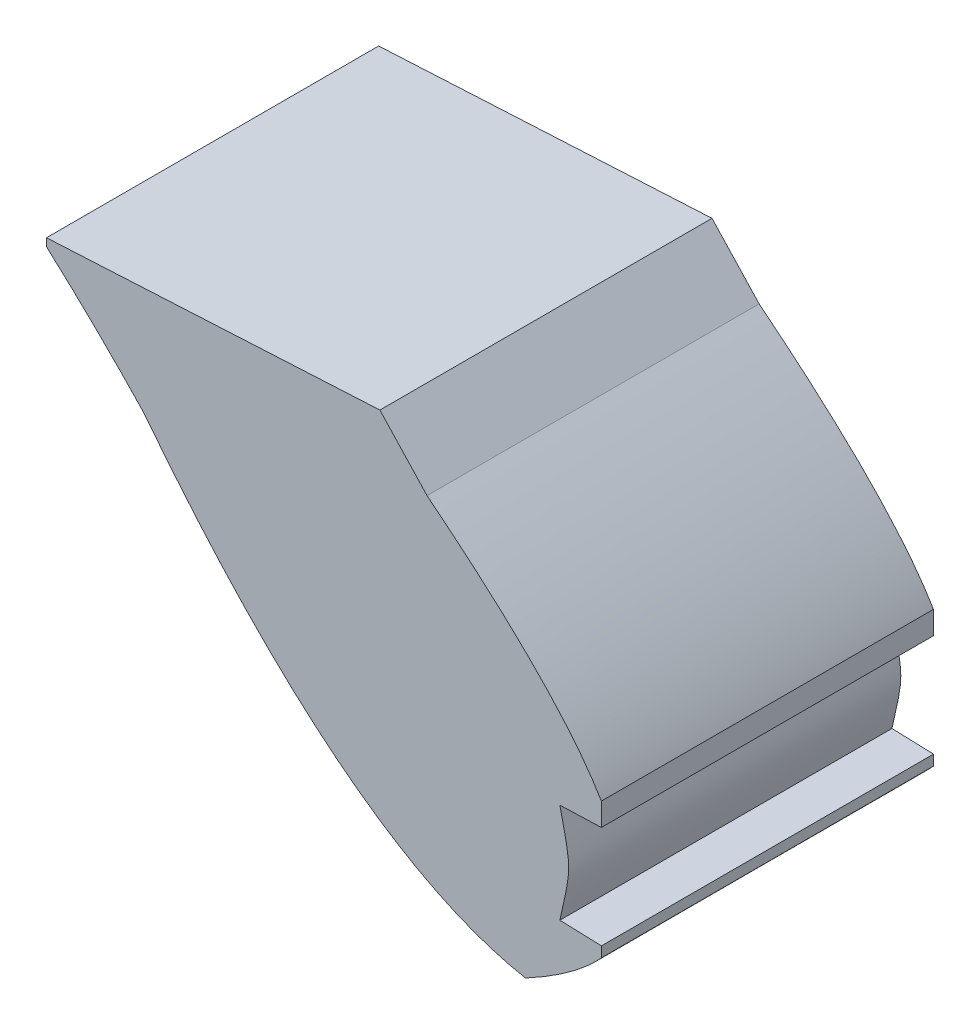
ISO-10303-21;
HEADER;
FILE_DESCRIPTION(('STEP AP214'),'2;1');
FILE_NAME('part.step','',(''),(''),'','','');
FILE_SCHEMA(('AUTOMOTIVE_DESIGN { 1 0 10303 214 1 1 1 1 }'));
ENDSEC;
DATA;
#1=APPLICATION_CONTEXT('core data for automotive mechanical design processes');
#2=APPLICATION_PROTOCOL_DEFINITION('international standard','automotive_design',2000,#1);
#3=PRODUCT_CONTEXT('',#1,'mechanical');
#4=PRODUCT('Part','Part','',(#3));
#5=PRODUCT_RELATED_PRODUCT_CATEGORY('part','',(#4));
#6=PRODUCT_DEFINITION_FORMATION('','',#4);
#7=PRODUCT_DEFINITION_CONTEXT('part definition',#1,'design');
#8=PRODUCT_DEFINITION('design','',#6,#7);
#9=PRODUCT_DEFINITION_SHAPE('','',#8);
#10=(LENGTH_UNIT() NAMED_UNIT(*) SI_UNIT(.MILLI.,.METRE.));
#11=(NAMED_UNIT(*) PLANE_ANGLE_UNIT() SI_UNIT($,.RADIAN.));
#12=(NAMED_UNIT(*) SI_UNIT($,.STERADIAN.) SOLID_ANGLE_UNIT());
#13=UNCERTAINTY_MEASURE_WITH_UNIT(LENGTH_MEASURE(1.E-05),#10,'distance_accuracy_value','');
#14=(GEOMETRIC_REPRESENTATION_CONTEXT(3) GLOBAL_UNCERTAINTY_ASSIGNED_CONTEXT((#13)) GLOBAL_UNIT_ASSIGNED_CONTEXT((#10,
#11,#12)) REPRESENTATION_CONTEXT('',''));
#15=CARTESIAN_POINT('',(0.,0.,0.));
#16=DIRECTION('',(0.,0.,1.));
#17=DIRECTION('',(1.,0.,0.));
#18=AXIS2_PLACEMENT_3D('',#15,#16,#17);
#19=CARTESIAN_POINT('',(-18.9451921135982,7.54091889574655,7.));
#20=CARTESIAN_POINT('',(-10.2150083842792,-3.69764410322756,7.));
#21=CARTESIAN_POINT('',(-2.84660482498738,-5.05908110388432,7.));
#22=(BOUNDED_CURVE() B_SPLINE_CURVE(2,(#19,#20,#21),.UNSPECIFIED.,.F.,
.F.) B_SPLINE_CURVE_WITH_KNOTS((3,3),(0.497667241108509,0.499554279588011),
.UNSPECIFIED.) CURVE() GEOMETRIC_REPRESENTATION_ITEM() RATIONAL_B_SPLINE_CURVE((1.,1.,1.)) REPRESENTATION_ITEM(''));
#23=DIRECTION('',(0.,0.,-1.));
#24=VECTOR('',#23,1.);
#25=SURFACE_OF_LINEAR_EXTRUSION('',#22,#24);
#26=CARTESIAN_POINT('',(-18.9451921135982,7.54091889574655,-7.));
#27=CARTESIAN_POINT('',(-10.2150083842792,-3.69764410322756,-7.));
#28=CARTESIAN_POINT('',(-2.84660482498738,-5.05908110388432,-7.));
#29=(BOUNDED_CURVE() B_SPLINE_CURVE(2,(#26,#27,#28),.UNSPECIFIED.,.F.,
.F.) B_SPLINE_CURVE_WITH_KNOTS((3,3),(0.497667241108509,0.499554279588011),
.UNSPECIFIED.) CURVE() GEOMETRIC_REPRESENTATION_ITEM() RATIONAL_B_SPLINE_CURVE((1.,1.,1.)) REPRESENTATION_ITEM(''));
#30=CARTESIAN_POINT('',(-18.9451921135982,7.54091889574657,-7.));
#31=VERTEX_POINT('',#30);
#32=CARTESIAN_POINT('',(-2.84660482498738,-5.05908110388432,-7.));
#33=VERTEX_POINT('',#32);
#34=EDGE_CURVE('E158',#31,#33,#29,.T.);
#35=ORIENTED_EDGE('',*,*,#34,.T.);
#36=DIRECTION('',(0.,0.,-1.));
#37=VECTOR('',#36,1.);
#38=CARTESIAN_POINT('',(-2.84660482498738,-5.05908110388432,7.));
#39=LINE('',#38,#37);
#40=CARTESIAN_POINT('',(-2.84660482498738,-5.05908110388432,7.));
#41=VERTEX_POINT('',#40);
#42=EDGE_CURVE('E11',#41,#33,#39,.T.);
#43=ORIENTED_EDGE('',*,*,#42,.F.);
#44=CARTESIAN_POINT('',(-18.9451921135982,7.54091889574657,7.));
#45=VERTEX_POINT('',#44);
#46=EDGE_CURVE('E206',#45,#41,#22,.T.);
#47=ORIENTED_EDGE('',*,*,#46,.F.);
#48=DIRECTION('',(0.,0.,-1.));
#49=VECTOR('',#48,1.);
#50=CARTESIAN_POINT('',(-18.9451921135982,7.54091889574657,7.));
#51=LINE('',#50,#49);
#52=EDGE_CURVE('E58',#45,#31,#51,.T.);
#53=ORIENTED_EDGE('',*,*,#52,.T.);
#54=EDGE_LOOP('',(#35,#43,#47,#53));
#55=FACE_BOUND('',#54,.T.);
#56=ADVANCED_FACE('F43',(#55),#25,.F.);
#57=CARTESIAN_POINT('',(-2.84660482498738,-5.05908110388432,7.));
#58=CARTESIAN_POINT('',(-0.742366881974002,-3.93520659958673,7.));
#59=CARTESIAN_POINT('',(0.355124999965198,-2.72325322699678,7.));
#60=(BOUNDED_CURVE() B_SPLINE_CURVE(2,(#57,#58,#59),.UNSPECIFIED.,.F.,
.F.) B_SPLINE_CURVE_WITH_KNOTS((3,3),(0.498812074629495,0.499412845463797),
.UNSPECIFIED.) CURVE() GEOMETRIC_REPRESENTATION_ITEM() RATIONAL_B_SPLINE_CURVE((1.,1.,1.)) REPRESENTATION_ITEM(''));
#61=DIRECTION('',(0.,0.,-1.));
#62=VECTOR('',#61,1.);
#63=SURFACE_OF_LINEAR_EXTRUSION('',#60,#62);
#64=CARTESIAN_POINT('',(-2.84660482498738,-5.05908110388432,-7.));
#65=CARTESIAN_POINT('',(-0.742366881974002,-3.93520659958673,-7.));
#66=CARTESIAN_POINT('',(0.355124999965198,-2.72325322699678,-7.));
#67=(BOUNDED_CURVE() B_SPLINE_CURVE(2,(#64,#65,#66),.UNSPECIFIED.,.F.,
.F.) B_SPLINE_CURVE_WITH_KNOTS((3,3),(0.498812074629495,0.499412845463797),
.UNSPECIFIED.) CURVE() GEOMETRIC_REPRESENTATION_ITEM() RATIONAL_B_SPLINE_CURVE((1.,1.,1.)) REPRESENTATION_ITEM(''));
#68=CARTESIAN_POINT('',(0.355124999965198,-2.72325322699678,-7.));
#69=VERTEX_POINT('',#68);
#70=EDGE_CURVE('E165',#33,#69,#67,.T.);
#71=ORIENTED_EDGE('',*,*,#70,.T.);
#72=DIRECTION('',(0.,0.,-1.));
#73=VECTOR('',#72,1.);
#74=CARTESIAN_POINT('',(0.355124999965198,-2.72325322699678,7.));
#75=LINE('',#74,#73);
#76=CARTESIAN_POINT('',(0.355124999965198,-2.72325322699678,7.));
#77=VERTEX_POINT('',#76);
#78=EDGE_CURVE('E55',#77,#69,#75,.T.);
#79=ORIENTED_EDGE('',*,*,#78,.F.);
#80=EDGE_CURVE('E104',#41,#77,#60,.T.);
#81=ORIENTED_EDGE('',*,*,#80,.F.);
#82=ORIENTED_EDGE('',*,*,#42,.T.);
#83=EDGE_LOOP('',(#71,#79,#81,#82));
#84=FACE_BOUND('',#83,.T.);
#85=ADVANCED_FACE('F227',(#84),#63,.F.);
#86=CARTESIAN_POINT('',(0.355125000532009,-7.39148800447813E-11,7.));
#87=DIRECTION('',(1.,-2.08137641489758E-10,0.));
#88=DIRECTION('',(2.08137641489758E-10,1.,0.));
#89=AXIS2_PLACEMENT_3D('',#86,#87,#88);
#90=PLANE('',#89);
#91=DIRECTION('',(-2.08137641489758E-10,-1.,0.));
#92=VECTOR('',#91,1.);
#93=CARTESIAN_POINT('',(0.355125000532009,-7.39148800447813E-11,-7.));
#94=LINE('',#93,#92);
#95=CARTESIAN_POINT('',(0.355125000056447,-2.28484178142545,-7.));
#96=VERTEX_POINT('',#95);
#97=EDGE_CURVE('E171',#96,#69,#94,.T.);
#98=ORIENTED_EDGE('',*,*,#97,.F.);
#99=DIRECTION('',(0.,0.,-1.));
#100=VECTOR('',#99,1.);
#101=CARTESIAN_POINT('',(0.355125000056447,-2.28484178142545,7.));
#102=LINE('',#101,#100);
#103=CARTESIAN_POINT('',(0.355125000056447,-2.28484178142545,7.));
#104=VERTEX_POINT('',#103);
#105=EDGE_CURVE('E222',#104,#96,#102,.T.);
#106=ORIENTED_EDGE('',*,*,#105,.F.);
#107=DIRECTION('',(-2.08137641489758E-10,-1.,0.));
#108=VECTOR('',#107,1.);
#109=CARTESIAN_POINT('',(0.355125000532009,-7.39148800447813E-11,7.));
#110=LINE('',#109,#108);
#111=EDGE_CURVE('E230',#104,#77,#110,.T.);
#112=ORIENTED_EDGE('',*,*,#111,.T.);
#113=ORIENTED_EDGE('',*,*,#78,.T.);
#114=EDGE_LOOP('',(#98,#106,#112,#113));
#115=FACE_BOUND('',#114,.T.);
#116=ADVANCED_FACE('F223',(#115),#90,.T.);
#117=CARTESIAN_POINT('',(-0.0792587195419091,-2.26967276768239,7.));
#118=DIRECTION('',(-0.0348994967024901,-0.999390827019096,0.));
#119=DIRECTION('',(0.999390827019096,-0.0348994967024901,0.));
#120=AXIS2_PLACEMENT_3D('',#117,#118,#119);
#121=PLANE('',#120);
#122=DIRECTION('',(-0.999390827019096,0.0348994967024901,0.));
#123=VECTOR('',#122,1.);
#124=CARTESIAN_POINT('',(-0.0792587195419091,-2.26967276768239,-7.));
#125=LINE('',#124,#123);
#126=CARTESIAN_POINT('',(-1.39487499994356,-2.22373043481491,-7.));
#127=VERTEX_POINT('',#126);
#128=EDGE_CURVE('E180',#96,#127,#125,.T.);
#129=ORIENTED_EDGE('',*,*,#128,.T.);
#130=DIRECTION('',(0.,0.,-1.));
#131=VECTOR('',#130,1.);
#132=CARTESIAN_POINT('',(-1.39487499994356,-2.22373043481491,7.));
#133=LINE('',#132,#131);
#134=CARTESIAN_POINT('',(-1.39487499994356,-2.22373043481491,7.));
#135=VERTEX_POINT('',#134);
#136=EDGE_CURVE('E217',#135,#127,#133,.T.);
#137=ORIENTED_EDGE('',*,*,#136,.F.);
#138=DIRECTION('',(-0.999390827019096,0.0348994967024901,0.));
#139=VECTOR('',#138,1.);
#140=CARTESIAN_POINT('',(-0.0792587195419091,-2.26967276768239,7.));
#141=LINE('',#140,#139);
#142=EDGE_CURVE('E249',#104,#135,#141,.T.);
#143=ORIENTED_EDGE('',*,*,#142,.F.);
#144=ORIENTED_EDGE('',*,*,#105,.T.);
#145=EDGE_LOOP('',(#129,#137,#143,#144));
#146=FACE_BOUND('',#145,.T.);
#147=ADVANCED_FACE('F240',(#146),#121,.F.);
#148=CARTESIAN_POINT('',(-1.39487499994356,-2.22373043481491,7.));
#149=CARTESIAN_POINT('',(-0.907530669798052,-0.123730434814926,7.));
#150=CARTESIAN_POINT('',(-1.39487499994356,1.976269565185,7.));
#151=(BOUNDED_CURVE() B_SPLINE_CURVE(2,(#148,#149,#150),.UNSPECIFIED.,.F.,
.F.) B_SPLINE_CURVE_WITH_KNOTS((3,3),(0.,1.),
.UNSPECIFIED.) CURVE() GEOMETRIC_REPRESENTATION_ITEM() RATIONAL_B_SPLINE_CURVE((1.,
3.23180121851367,1.)) REPRESENTATION_ITEM(''));
#152=DIRECTION('',(0.,0.,-1.));
#153=VECTOR('',#152,1.);
#154=SURFACE_OF_LINEAR_EXTRUSION('',#151,#153);
#155=CARTESIAN_POINT('',(-1.39487499994356,-2.22373043481491,-7.));
#156=CARTESIAN_POINT('',(-0.907530669798052,-0.123730434814926,-7.));
#157=CARTESIAN_POINT('',(-1.39487499994356,1.976269565185,-7.));
#158=(BOUNDED_CURVE() B_SPLINE_CURVE(2,(#155,#156,#157),.UNSPECIFIED.,.F.,
.F.) B_SPLINE_CURVE_WITH_KNOTS((3,3),(0.,1.),
.UNSPECIFIED.) CURVE() GEOMETRIC_REPRESENTATION_ITEM() RATIONAL_B_SPLINE_CURVE((1.,
3.23180121851367,1.)) REPRESENTATION_ITEM(''));
#159=CARTESIAN_POINT('',(-1.39487499994356,1.976269565185,-7.));
#160=VERTEX_POINT('',#159);
#161=EDGE_CURVE('E177',#127,#160,#158,.T.);
#162=ORIENTED_EDGE('',*,*,#161,.T.);
#163=DIRECTION('',(0.,0.,-1.));
#164=VECTOR('',#163,1.);
#165=CARTESIAN_POINT('',(-1.39487499994356,1.976269565185,7.));
#166=LINE('',#165,#164);
#167=CARTESIAN_POINT('',(-1.39487499994356,1.976269565185,7.));
#168=VERTEX_POINT('',#167);
#169=EDGE_CURVE('E214',#168,#160,#166,.T.);
#170=ORIENTED_EDGE('',*,*,#169,.F.);
#171=EDGE_CURVE('E243',#135,#168,#151,.T.);
#172=ORIENTED_EDGE('',*,*,#171,.F.);
#173=ORIENTED_EDGE('',*,*,#136,.T.);
#174=EDGE_LOOP('',(#162,#170,#172,#173));
#175=FACE_BOUND('',#174,.T.);
#176=ADVANCED_FACE('F244',(#175),#154,.F.);
#177=CARTESIAN_POINT('',(0.355125000055651,-1.23774703808888E-13,7.));
#178=DIRECTION('',(-1.,3.48538412642003E-13,0.));
#179=DIRECTION('',(-3.48538412642003E-13,-1.,0.));
#180=AXIS2_PLACEMENT_3D('',#177,#178,#179);
#181=PLANE('',#180);
#182=DIRECTION('',(3.48538412642003E-13,1.,0.));
#183=VECTOR('',#182,1.);
#184=CARTESIAN_POINT('',(0.355125000055651,-1.23774703808888E-13,-7.));
#185=LINE('',#184,#183);
#186=CARTESIAN_POINT('',(0.355125000056447,2.03738091179555,-7.));
#187=VERTEX_POINT('',#186);
#188=CARTESIAN_POINT('',(0.355125000056697,3.0015495286345,-7.));
#189=VERTEX_POINT('',#188);
#190=EDGE_CURVE('E184',#187,#189,#185,.T.);
#191=ORIENTED_EDGE('',*,*,#190,.T.);
#192=DIRECTION('',(0.,0.,-1.));
#193=VECTOR('',#192,1.);
#194=CARTESIAN_POINT('',(0.355125000056697,3.0015495286345,7.));
#195=LINE('',#194,#193);
#196=CARTESIAN_POINT('',(0.355125000056697,3.0015495286345,7.));
#197=VERTEX_POINT('',#196);
#198=EDGE_CURVE('E215',#197,#189,#195,.T.);
#199=ORIENTED_EDGE('',*,*,#198,.F.);
#200=DIRECTION('',(3.48538412642003E-13,1.,0.));
#201=VECTOR('',#200,1.);
#202=CARTESIAN_POINT('',(0.355125000055651,-1.23774703808888E-13,7.));
#203=LINE('',#202,#201);
#204=CARTESIAN_POINT('',(0.355125000056447,2.03738091179555,7.));
#205=VERTEX_POINT('',#204);
#206=EDGE_CURVE('E250',#205,#197,#203,.T.);
#207=ORIENTED_EDGE('',*,*,#206,.F.);
#208=DIRECTION('',(0.,0.,-1.));
#209=VECTOR('',#208,1.);
#210=CARTESIAN_POINT('',(0.355125000056447,2.03738091179555,7.));
#211=LINE('',#210,#209);
#212=EDGE_CURVE('E162',#205,#187,#211,.T.);
#213=ORIENTED_EDGE('',*,*,#212,.T.);
#214=EDGE_LOOP('',(#191,#199,#207,#213));
#215=FACE_BOUND('',#214,.T.);
#216=ADVANCED_FACE('F264',(#215),#181,.F.);
#217=CARTESIAN_POINT('',(0.355125000056697,3.0015495286345,7.));
#218=CARTESIAN_POINT('',(-1.44872627004384,6.0584273141466,7.));
#219=CARTESIAN_POINT('',(-6.99487502582887,10.4773899922143,7.));
#220=(BOUNDED_CURVE() B_SPLINE_CURVE(2,(#217,#218,#219),.UNSPECIFIED.,.F.,
.F.) B_SPLINE_CURVE_WITH_KNOTS((3,3),(0.500820705122982,0.502013311782223),
.UNSPECIFIED.) CURVE() GEOMETRIC_REPRESENTATION_ITEM() RATIONAL_B_SPLINE_CURVE((1.,1.,1.)) REPRESENTATION_ITEM(''));
#221=DIRECTION('',(0.,0.,-1.));
#222=VECTOR('',#221,1.);
#223=SURFACE_OF_LINEAR_EXTRUSION('',#220,#222);
#224=CARTESIAN_POINT('',(0.355125000056697,3.0015495286345,-7.));
#225=CARTESIAN_POINT('',(-1.44872627004384,6.0584273141466,-7.));
#226=CARTESIAN_POINT('',(-6.99487502582887,10.4773899922143,-7.));
#227=(BOUNDED_CURVE() B_SPLINE_CURVE(2,(#224,#225,#226),.UNSPECIFIED.,.F.,
.F.) B_SPLINE_CURVE_WITH_KNOTS((3,3),(0.500820705122982,0.502013311782223),
.UNSPECIFIED.) CURVE() GEOMETRIC_REPRESENTATION_ITEM() RATIONAL_B_SPLINE_CURVE((1.,1.,1.)) REPRESENTATION_ITEM(''));
#228=CARTESIAN_POINT('',(-6.99487502582887,10.4773899922143,-7.));
#229=VERTEX_POINT('',#228);
#230=EDGE_CURVE('E188',#189,#229,#227,.T.);
#231=ORIENTED_EDGE('',*,*,#230,.T.);
#232=DIRECTION('',(0.,0.,-1.));
#233=VECTOR('',#232,1.);
#234=CARTESIAN_POINT('',(-6.99487502582887,10.4773899922143,7.));
#235=LINE('',#234,#233);
#236=CARTESIAN_POINT('',(-6.99487502582887,10.4773899922143,7.));
#237=VERTEX_POINT('',#236);
#238=EDGE_CURVE('E209',#237,#229,#235,.T.);
#239=ORIENTED_EDGE('',*,*,#238,.F.);
#240=EDGE_CURVE('E248',#197,#237,#220,.T.);
#241=ORIENTED_EDGE('',*,*,#240,.F.);
#242=ORIENTED_EDGE('',*,*,#198,.T.);
#243=EDGE_LOOP('',(#231,#239,#241,#242));
#244=FACE_BOUND('',#243,.T.);
#245=ADVANCED_FACE('F301',(#244),#223,.F.);
#246=CARTESIAN_POINT('',(1.48452736456058,1.38434415860098,7.));
#247=DIRECTION('',(0.731353702758341,0.681998358840887,0.));
#248=DIRECTION('',(-0.681998358840887,0.731353702758341,0.));
#249=AXIS2_PLACEMENT_3D('',#246,#247,#248);
#250=PLANE('',#249);
#251=DIRECTION('',(0.681998358840887,-0.731353702758341,0.));
#252=VECTOR('',#251,1.);
#253=CARTESIAN_POINT('',(1.48452736456058,1.38434415860098,-7.));
#254=LINE('',#253,#252);
#255=CARTESIAN_POINT('',(-8.98184569452943,12.6081551722012,-7.));
#256=VERTEX_POINT('',#255);
#257=EDGE_CURVE('E191',#256,#229,#254,.T.);
#258=ORIENTED_EDGE('',*,*,#257,.F.);
#259=DIRECTION('',(0.,0.,-1.));
#260=VECTOR('',#259,1.);
#261=CARTESIAN_POINT('',(-8.98184569452943,12.6081551722012,7.));
#262=LINE('',#261,#260);
#263=CARTESIAN_POINT('',(-8.98184569452943,12.6081551722012,7.));
#264=VERTEX_POINT('',#263);
#265=EDGE_CURVE('E147',#264,#256,#262,.T.);
#266=ORIENTED_EDGE('',*,*,#265,.F.);
#267=DIRECTION('',(0.681998358840887,-0.731353702758341,0.));
#268=VECTOR('',#267,1.);
#269=CARTESIAN_POINT('',(1.48452736456058,1.38434415860098,7.));
#270=LINE('',#269,#268);
#271=EDGE_CURVE('E138',#264,#237,#270,.T.);
#272=ORIENTED_EDGE('',*,*,#271,.T.);
#273=ORIENTED_EDGE('',*,*,#238,.T.);
#274=EDGE_LOOP('',(#258,#266,#272,#273));
#275=FACE_BOUND('',#274,.T.);
#276=ADVANCED_FACE('F307',(#275),#250,.T.);
#277=CARTESIAN_POINT('',(-0.683557287645435,13.0430500394562,7.));
#278=DIRECTION('',(0.0523359562429403,-0.998629534754574,0.));
#279=DIRECTION('',(0.998629534754574,0.0523359562429404,0.));
#280=AXIS2_PLACEMENT_3D('',#277,#278,#279);
#281=PLANE('',#280);
#282=DIRECTION('',(-0.998629534754574,-0.0523359562429403,0.));
#283=VECTOR('',#282,1.);
#284=CARTESIAN_POINT('',(-0.683557287645435,13.0430500394562,-7.));
#285=LINE('',#284,#283);
#286=CARTESIAN_POINT('',(-23.0359211456035,11.8716122879342,-7.));
#287=VERTEX_POINT('',#286);
#288=EDGE_CURVE('E150',#256,#287,#285,.T.);
#289=ORIENTED_EDGE('',*,*,#288,.T.);
#290=DIRECTION('',(0.,0.,-1.));
#291=VECTOR('',#290,1.);
#292=CARTESIAN_POINT('',(-23.0359211456035,11.8716122879342,7.));
#293=LINE('',#292,#291);
#294=CARTESIAN_POINT('',(-23.0359211456035,11.8716122879342,7.));
#295=VERTEX_POINT('',#294);
#296=EDGE_CURVE('E145',#295,#287,#293,.T.);
#297=ORIENTED_EDGE('',*,*,#296,.F.);
#298=DIRECTION('',(-0.998629534754574,-0.0523359562429403,0.));
#299=VECTOR('',#298,1.);
#300=CARTESIAN_POINT('',(-0.683557287645435,13.0430500394562,7.));
#301=LINE('',#300,#299);
#302=EDGE_CURVE('E135',#264,#295,#301,.T.);
#303=ORIENTED_EDGE('',*,*,#302,.F.);
#304=ORIENTED_EDGE('',*,*,#265,.T.);
#305=EDGE_LOOP('',(#289,#297,#303,#304));
#306=FACE_BOUND('',#305,.T.);
#307=ADVANCED_FACE('F144',(#306),#281,.F.);
#308=CARTESIAN_POINT('',(-23.0359211456035,0.,7.));
#309=DIRECTION('',(-1.,0.,0.));
#310=DIRECTION('',(0.,0.,1.));
#311=AXIS2_PLACEMENT_3D('',#308,#309,#310);
#312=PLANE('',#311);
#313=DIRECTION('',(0.,1.,0.));
#314=VECTOR('',#313,1.);
#315=CARTESIAN_POINT('',(-23.0359211456035,0.,-7.));
#316=LINE('',#315,#314);
#317=CARTESIAN_POINT('',(-23.0359211456035,11.5401378200983,-7.));
#318=VERTEX_POINT('',#317);
#319=EDGE_CURVE('E203',#318,#287,#316,.T.);
#320=ORIENTED_EDGE('',*,*,#319,.F.);
#321=DIRECTION('',(0.,0.,-1.));
#322=VECTOR('',#321,1.);
#323=CARTESIAN_POINT('',(-23.0359211456035,11.5401378200983,7.));
#324=LINE('',#323,#322);
#325=CARTESIAN_POINT('',(-23.0359211456035,11.5401378200983,7.));
#326=VERTEX_POINT('',#325);
#327=EDGE_CURVE('E91',#326,#318,#324,.T.);
#328=ORIENTED_EDGE('',*,*,#327,.F.);
#329=DIRECTION('',(0.,1.,0.));
#330=VECTOR('',#329,1.);
#331=CARTESIAN_POINT('',(-23.0359211456035,0.,7.));
#332=LINE('',#331,#330);
#333=EDGE_CURVE('E139',#326,#295,#332,.T.);
#334=ORIENTED_EDGE('',*,*,#333,.T.);
#335=ORIENTED_EDGE('',*,*,#296,.T.);
#336=EDGE_LOOP('',(#320,#328,#334,#335));
#337=FACE_BOUND('',#336,.T.);
#338=ADVANCED_FACE('F155',(#337),#312,.T.);
#339=CARTESIAN_POINT('',(-69.8841339427642,-40.4718315495759,7.));
#340=DIRECTION('',(0.,0.,-1.));
#341=DIRECTION('',(-1.,0.,0.));
#342=AXIS2_PLACEMENT_3D('',#339,#340,#341);
#343=CYLINDRICAL_SURFACE('',#342,69.9999999999998);
#344=CARTESIAN_POINT('',(-69.8841339427642,-40.4718315495759,-7.));
#345=DIRECTION('',(0.,0.,1.));
#346=DIRECTION('',(1.,0.,0.));
#347=AXIS2_PLACEMENT_3D('',#344,#345,#346);
#348=CIRCLE('',#347,69.9999999999998);
#349=EDGE_CURVE('E201',#31,#318,#348,.T.);
#350=ORIENTED_EDGE('',*,*,#349,.F.);
#351=ORIENTED_EDGE('',*,*,#52,.F.);
#352=CARTESIAN_POINT('',(-69.8841339427642,-40.4718315495759,7.));
#353=DIRECTION('',(0.,0.,1.));
#354=DIRECTION('',(1.,0.,0.));
#355=AXIS2_PLACEMENT_3D('',#352,#353,#354);
#356=CIRCLE('',#355,69.9999999999998);
#357=EDGE_CURVE('E153',#45,#326,#356,.T.);
#358=ORIENTED_EDGE('',*,*,#357,.T.);
#359=ORIENTED_EDGE('',*,*,#327,.T.);
#360=EDGE_LOOP('',(#350,#351,#358,#359));
#361=FACE_BOUND('',#360,.T.);
#362=ADVANCED_FACE('F325',(#361),#343,.F.);
#363=CARTESIAN_POINT('',(0.,0.,7.));
#364=DIRECTION('',(0.,0.,1.));
#365=DIRECTION('',(1.,0.,0.));
#366=AXIS2_PLACEMENT_3D('',#363,#364,#365);
#367=PLANE('',#366);
#368=ORIENTED_EDGE('',*,*,#46,.T.);
#369=ORIENTED_EDGE('',*,*,#80,.T.);
#370=ORIENTED_EDGE('',*,*,#111,.F.);
#371=ORIENTED_EDGE('',*,*,#142,.T.);
#372=ORIENTED_EDGE('',*,*,#171,.T.);
#373=DIRECTION('',(0.999390827019096,0.0348994967024943,0.));
#374=VECTOR('',#373,1.);
#375=CARTESIAN_POINT('',(-1.39487499994356,1.976269565185,7.));
#376=LINE('',#375,#374);
#377=EDGE_CURVE('E290',#168,#205,#376,.T.);
#378=ORIENTED_EDGE('',*,*,#377,.T.);
#379=ORIENTED_EDGE('',*,*,#206,.T.);
#380=ORIENTED_EDGE('',*,*,#240,.T.);
#381=ORIENTED_EDGE('',*,*,#271,.F.);
#382=ORIENTED_EDGE('',*,*,#302,.T.);
#383=ORIENTED_EDGE('',*,*,#333,.F.);
#384=ORIENTED_EDGE('',*,*,#357,.F.);
#385=EDGE_LOOP('',(#368,#369,#370,#371,#372,#378,#379,#380,#381,#382,#383,#384));
#386=FACE_BOUND('',#385,.T.);
#387=ADVANCED_FACE('F132',(#386),#367,.T.);
#388=CARTESIAN_POINT('',(0.,0.,-7.));
#389=DIRECTION('',(0.,0.,1.));
#390=DIRECTION('',(1.,0.,0.));
#391=AXIS2_PLACEMENT_3D('',#388,#389,#390);
#392=PLANE('',#391);
#393=ORIENTED_EDGE('',*,*,#34,.F.);
#394=ORIENTED_EDGE('',*,*,#349,.T.);
#395=ORIENTED_EDGE('',*,*,#319,.T.);
#396=ORIENTED_EDGE('',*,*,#288,.F.);
#397=ORIENTED_EDGE('',*,*,#257,.T.);
#398=ORIENTED_EDGE('',*,*,#230,.F.);
#399=ORIENTED_EDGE('',*,*,#190,.F.);
#400=DIRECTION('',(0.999390827019096,0.0348994967024943,0.));
#401=VECTOR('',#400,1.);
#402=CARTESIAN_POINT('',(-1.39487499994356,1.976269565185,-7.));
#403=LINE('',#402,#401);
#404=EDGE_CURVE('E287',#160,#187,#403,.T.);
#405=ORIENTED_EDGE('',*,*,#404,.F.);
#406=ORIENTED_EDGE('',*,*,#161,.F.);
#407=ORIENTED_EDGE('',*,*,#128,.F.);
#408=ORIENTED_EDGE('',*,*,#97,.T.);
#409=ORIENTED_EDGE('',*,*,#70,.F.);
#410=EDGE_LOOP('',(#393,#394,#395,#396,#397,#398,#399,#405,#406,#407,#408,#409));
#411=FACE_BOUND('',#410,.T.);
#412=ADVANCED_FACE('F235',(#411),#392,.F.);
#413=CARTESIAN_POINT('',(-1.39487499994356,1.976269565185,7.));
#414=DIRECTION('',(-0.0348994967024943,0.999390827019096,0.));
#415=DIRECTION('',(-0.999390827019096,-0.0348994967024943,0.));
#416=AXIS2_PLACEMENT_3D('',#413,#414,#415);
#417=PLANE('',#416);
#418=ORIENTED_EDGE('',*,*,#169,.T.);
#419=ORIENTED_EDGE('',*,*,#404,.T.);
#420=ORIENTED_EDGE('',*,*,#212,.F.);
#421=ORIENTED_EDGE('',*,*,#377,.F.);
#422=EDGE_LOOP('',(#418,#419,#420,#421));
#423=FACE_BOUND('',#422,.T.);
#424=ADVANCED_FACE('F294',(#423),#417,.F.);
#425=CLOSED_SHELL('',(#56,#85,#116,#147,#176,#216,#245,#276,#307,#338,#362,#387,#412,#424));
#426=MANIFOLD_SOLID_BREP('B2',#425);
#427=ADVANCED_BREP_SHAPE_REPRESENTATION('',(#18,#426),#14);
#428=SHAPE_DEFINITION_REPRESENTATION(#9,#427);
ENDSEC;
END-ISO-10303-21;
